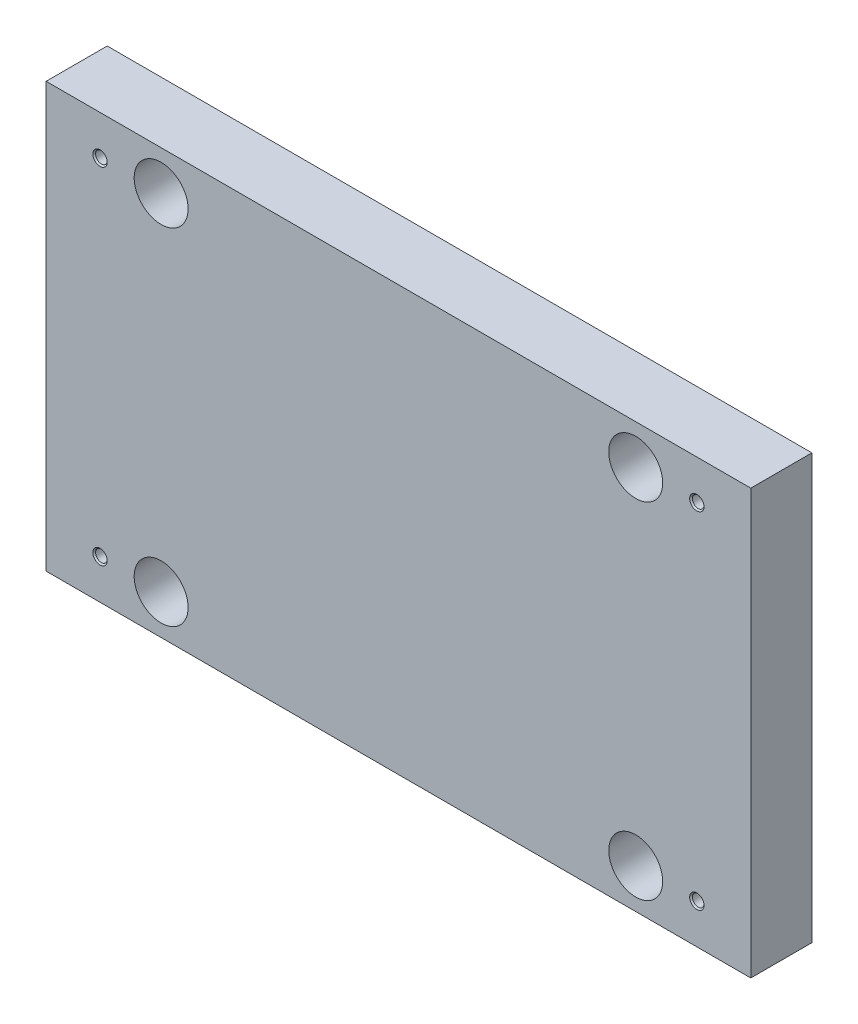
ISO-10303-21;
HEADER;
FILE_DESCRIPTION(('STEP AP214'),'2;1');
FILE_NAME('part.step','',(''),(''),'','','');
FILE_SCHEMA(('AUTOMOTIVE_DESIGN { 1 0 10303 214 1 1 1 1 }'));
ENDSEC;
DATA;
#1=APPLICATION_CONTEXT('core data for automotive mechanical design processes');
#2=APPLICATION_PROTOCOL_DEFINITION('international standard','automotive_design',2000,#1);
#3=PRODUCT_CONTEXT('',#1,'mechanical');
#4=PRODUCT('Part','Part','',(#3));
#5=PRODUCT_RELATED_PRODUCT_CATEGORY('part','',(#4));
#6=PRODUCT_DEFINITION_FORMATION('','',#4);
#7=PRODUCT_DEFINITION_CONTEXT('part definition',#1,'design');
#8=PRODUCT_DEFINITION('design','',#6,#7);
#9=PRODUCT_DEFINITION_SHAPE('','',#8);
#10=(LENGTH_UNIT() NAMED_UNIT(*) SI_UNIT(.MILLI.,.METRE.));
#11=(NAMED_UNIT(*) PLANE_ANGLE_UNIT() SI_UNIT($,.RADIAN.));
#12=(NAMED_UNIT(*) SI_UNIT($,.STERADIAN.) SOLID_ANGLE_UNIT());
#13=UNCERTAINTY_MEASURE_WITH_UNIT(LENGTH_MEASURE(1.E-05),#10,'distance_accuracy_value','');
#14=(GEOMETRIC_REPRESENTATION_CONTEXT(3) GLOBAL_UNCERTAINTY_ASSIGNED_CONTEXT((#13)) GLOBAL_UNIT_ASSIGNED_CONTEXT((#10,
#11,#12)) REPRESENTATION_CONTEXT('',''));
#15=CARTESIAN_POINT('',(0.,0.,0.));
#16=DIRECTION('',(0.,0.,1.));
#17=DIRECTION('',(1.,0.,0.));
#18=AXIS2_PLACEMENT_3D('',#15,#16,#17);
#19=CARTESIAN_POINT('',(98.,-59.,0.));
#20=DIRECTION('',(1.,0.,0.));
#21=DIRECTION('',(0.,0.,-1.));
#22=AXIS2_PLACEMENT_3D('',#19,#20,#21);
#23=PLANE('',#22);
#24=DIRECTION('',(0.,1.,0.));
#25=VECTOR('',#24,1.);
#26=CARTESIAN_POINT('',(98.,-59.,17.));
#27=LINE('',#26,#25);
#28=CARTESIAN_POINT('',(98.,-59.,17.));
#29=VERTEX_POINT('',#28);
#30=CARTESIAN_POINT('',(98.,59.,17.));
#31=VERTEX_POINT('',#30);
#32=EDGE_CURVE('E127',#29,#31,#27,.T.);
#33=ORIENTED_EDGE('',*,*,#32,.F.);
#34=DIRECTION('',(0.,0.,1.));
#35=VECTOR('',#34,1.);
#36=CARTESIAN_POINT('',(98.,-59.,0.));
#37=LINE('',#36,#35);
#38=CARTESIAN_POINT('',(98.,-59.,0.));
#39=VERTEX_POINT('',#38);
#40=EDGE_CURVE('E57',#39,#29,#37,.T.);
#41=ORIENTED_EDGE('',*,*,#40,.F.);
#42=DIRECTION('',(0.,1.,0.));
#43=VECTOR('',#42,1.);
#44=CARTESIAN_POINT('',(98.,-59.,0.));
#45=LINE('',#44,#43);
#46=CARTESIAN_POINT('',(98.,59.,0.));
#47=VERTEX_POINT('',#46);
#48=EDGE_CURVE('E128',#39,#47,#45,.T.);
#49=ORIENTED_EDGE('',*,*,#48,.T.);
#50=DIRECTION('',(0.,0.,1.));
#51=VECTOR('',#50,1.);
#52=CARTESIAN_POINT('',(98.,59.,0.));
#53=LINE('',#52,#51);
#54=EDGE_CURVE('E86',#47,#31,#53,.T.);
#55=ORIENTED_EDGE('',*,*,#54,.T.);
#56=EDGE_LOOP('',(#33,#41,#49,#55));
#57=FACE_BOUND('',#56,.T.);
#58=ADVANCED_FACE('F39',(#57),#23,.T.);
#59=CARTESIAN_POINT('',(-98.,-59.,0.));
#60=DIRECTION('',(0.,-1.,0.));
#61=DIRECTION('',(0.,0.,-1.));
#62=AXIS2_PLACEMENT_3D('',#59,#60,#61);
#63=PLANE('',#62);
#64=DIRECTION('',(1.,0.,0.));
#65=VECTOR('',#64,1.);
#66=CARTESIAN_POINT('',(-98.,-59.,17.));
#67=LINE('',#66,#65);
#68=CARTESIAN_POINT('',(-98.,-59.,17.));
#69=VERTEX_POINT('',#68);
#70=EDGE_CURVE('E131',#69,#29,#67,.T.);
#71=ORIENTED_EDGE('',*,*,#70,.F.);
#72=DIRECTION('',(0.,0.,1.));
#73=VECTOR('',#72,1.);
#74=CARTESIAN_POINT('',(-98.,-59.,0.));
#75=LINE('',#74,#73);
#76=CARTESIAN_POINT('',(-98.,-59.,0.));
#77=VERTEX_POINT('',#76);
#78=EDGE_CURVE('E75',#77,#69,#75,.T.);
#79=ORIENTED_EDGE('',*,*,#78,.F.);
#80=DIRECTION('',(1.,0.,0.));
#81=VECTOR('',#80,1.);
#82=CARTESIAN_POINT('',(-98.,-59.,0.));
#83=LINE('',#82,#81);
#84=EDGE_CURVE('E135',#77,#39,#83,.T.);
#85=ORIENTED_EDGE('',*,*,#84,.T.);
#86=ORIENTED_EDGE('',*,*,#40,.T.);
#87=EDGE_LOOP('',(#71,#79,#85,#86));
#88=FACE_BOUND('',#87,.T.);
#89=ADVANCED_FACE('F187',(#88),#63,.T.);
#90=CARTESIAN_POINT('',(-98.,59.,0.));
#91=DIRECTION('',(-1.,0.,0.));
#92=DIRECTION('',(0.,0.,1.));
#93=AXIS2_PLACEMENT_3D('',#90,#91,#92);
#94=PLANE('',#93);
#95=DIRECTION('',(0.,-1.,0.));
#96=VECTOR('',#95,1.);
#97=CARTESIAN_POINT('',(-98.,59.,17.));
#98=LINE('',#97,#96);
#99=CARTESIAN_POINT('',(-98.,59.,17.));
#100=VERTEX_POINT('',#99);
#101=EDGE_CURVE('E142',#100,#69,#98,.T.);
#102=ORIENTED_EDGE('',*,*,#101,.F.);
#103=DIRECTION('',(0.,0.,1.));
#104=VECTOR('',#103,1.);
#105=CARTESIAN_POINT('',(-98.,59.,0.));
#106=LINE('',#105,#104);
#107=CARTESIAN_POINT('',(-98.,59.,0.));
#108=VERTEX_POINT('',#107);
#109=EDGE_CURVE('E149',#108,#100,#106,.T.);
#110=ORIENTED_EDGE('',*,*,#109,.F.);
#111=DIRECTION('',(0.,-1.,0.));
#112=VECTOR('',#111,1.);
#113=CARTESIAN_POINT('',(-98.,59.,0.));
#114=LINE('',#113,#112);
#115=EDGE_CURVE('E133',#108,#77,#114,.T.);
#116=ORIENTED_EDGE('',*,*,#115,.T.);
#117=ORIENTED_EDGE('',*,*,#78,.T.);
#118=EDGE_LOOP('',(#102,#110,#116,#117));
#119=FACE_BOUND('',#118,.T.);
#120=ADVANCED_FACE('F192',(#119),#94,.T.);
#121=CARTESIAN_POINT('',(98.,59.,0.));
#122=DIRECTION('',(0.,1.,0.));
#123=DIRECTION('',(0.,0.,1.));
#124=AXIS2_PLACEMENT_3D('',#121,#122,#123);
#125=PLANE('',#124);
#126=DIRECTION('',(-1.,0.,0.));
#127=VECTOR('',#126,1.);
#128=CARTESIAN_POINT('',(98.,59.,17.));
#129=LINE('',#128,#127);
#130=EDGE_CURVE('E139',#31,#100,#129,.T.);
#131=ORIENTED_EDGE('',*,*,#130,.F.);
#132=ORIENTED_EDGE('',*,*,#54,.F.);
#133=DIRECTION('',(-1.,0.,0.));
#134=VECTOR('',#133,1.);
#135=CARTESIAN_POINT('',(98.,59.,0.));
#136=LINE('',#135,#134);
#137=EDGE_CURVE('E130',#47,#108,#136,.T.);
#138=ORIENTED_EDGE('',*,*,#137,.T.);
#139=ORIENTED_EDGE('',*,*,#109,.T.);
#140=EDGE_LOOP('',(#131,#132,#138,#139));
#141=FACE_BOUND('',#140,.T.);
#142=ADVANCED_FACE('F196',(#141),#125,.T.);
#143=CARTESIAN_POINT('',(0.,0.,0.));
#144=DIRECTION('',(0.,0.,1.));
#145=DIRECTION('',(1.,0.,0.));
#146=AXIS2_PLACEMENT_3D('',#143,#144,#145);
#147=PLANE('',#146);
#148=CARTESIAN_POINT('',(66.,48.,0.));
#149=DIRECTION('',(0.,0.,1.));
#150=DIRECTION('',(1.,0.,0.));
#151=AXIS2_PLACEMENT_3D('',#148,#149,#150);
#152=CIRCLE('',#151,4.5);
#153=CARTESIAN_POINT('',(70.5,48.,0.));
#154=VERTEX_POINT('',#153);
#155=EDGE_CURVE('E502',#154,#154,#152,.T.);
#156=ORIENTED_EDGE('',*,*,#155,.T.);
#157=EDGE_LOOP('',(#156));
#158=FACE_BOUND('',#157,.T.);
#159=CARTESIAN_POINT('',(66.,-48.,0.));
#160=DIRECTION('',(0.,0.,1.));
#161=DIRECTION('',(1.,0.,0.));
#162=AXIS2_PLACEMENT_3D('',#159,#160,#161);
#163=CIRCLE('',#162,4.5);
#164=CARTESIAN_POINT('',(70.5,-48.,0.));
#165=VERTEX_POINT('',#164);
#166=EDGE_CURVE('E490',#165,#165,#163,.T.);
#167=ORIENTED_EDGE('',*,*,#166,.T.);
#168=EDGE_LOOP('',(#167));
#169=FACE_BOUND('',#168,.T.);
#170=CARTESIAN_POINT('',(-66.,48.,0.));
#171=DIRECTION('',(0.,0.,1.));
#172=DIRECTION('',(1.,0.,0.));
#173=AXIS2_PLACEMENT_3D('',#170,#171,#172);
#174=CIRCLE('',#173,4.50000000000001);
#175=CARTESIAN_POINT('',(-61.5,48.,0.));
#176=VERTEX_POINT('',#175);
#177=EDGE_CURVE('E478',#176,#176,#174,.T.);
#178=ORIENTED_EDGE('',*,*,#177,.T.);
#179=EDGE_LOOP('',(#178));
#180=FACE_BOUND('',#179,.T.);
#181=CARTESIAN_POINT('',(-66.,-48.,0.));
#182=DIRECTION('',(0.,0.,1.));
#183=DIRECTION('',(1.,0.,0.));
#184=AXIS2_PLACEMENT_3D('',#181,#182,#183);
#185=CIRCLE('',#184,4.50000000000001);
#186=CARTESIAN_POINT('',(-61.5,-48.,0.));
#187=VERTEX_POINT('',#186);
#188=EDGE_CURVE('E112',#187,#187,#185,.T.);
#189=ORIENTED_EDGE('',*,*,#188,.T.);
#190=EDGE_LOOP('',(#189));
#191=FACE_BOUND('',#190,.T.);
#192=ORIENTED_EDGE('',*,*,#48,.F.);
#193=ORIENTED_EDGE('',*,*,#84,.F.);
#194=ORIENTED_EDGE('',*,*,#115,.F.);
#195=ORIENTED_EDGE('',*,*,#137,.F.);
#196=EDGE_LOOP('',(#192,#193,#194,#195));
#197=FACE_BOUND('',#196,.T.);
#198=ADVANCED_FACE('F236',(#158,#169,#180,#191,#197),#147,.F.);
#199=CARTESIAN_POINT('',(0.,0.,17.));
#200=DIRECTION('',(0.,0.,1.));
#201=DIRECTION('',(1.,0.,0.));
#202=AXIS2_PLACEMENT_3D('',#199,#200,#201);
#203=PLANE('',#202);
#204=CARTESIAN_POINT('',(83.,-48.,17.));
#205=DIRECTION('',(0.,0.,1.));
#206=DIRECTION('',(1.,0.,0.));
#207=AXIS2_PLACEMENT_3D('',#204,#205,#206);
#208=CIRCLE('',#207,2.);
#209=CARTESIAN_POINT('',(85.,-48.,17.));
#210=VERTEX_POINT('',#209);
#211=EDGE_CURVE('E163',#210,#210,#208,.F.);
#212=ORIENTED_EDGE('',*,*,#211,.T.);
#213=EDGE_LOOP('',(#212));
#214=FACE_BOUND('',#213,.T.);
#215=CARTESIAN_POINT('',(83.,48.,17.));
#216=DIRECTION('',(0.,0.,1.));
#217=DIRECTION('',(1.,0.,0.));
#218=AXIS2_PLACEMENT_3D('',#215,#216,#217);
#219=CIRCLE('',#218,2.);
#220=CARTESIAN_POINT('',(85.,48.,17.));
#221=VERTEX_POINT('',#220);
#222=EDGE_CURVE('E160',#221,#221,#219,.F.);
#223=ORIENTED_EDGE('',*,*,#222,.T.);
#224=EDGE_LOOP('',(#223));
#225=FACE_BOUND('',#224,.T.);
#226=CARTESIAN_POINT('',(-83.,48.,17.));
#227=DIRECTION('',(0.,0.,1.));
#228=DIRECTION('',(1.,0.,0.));
#229=AXIS2_PLACEMENT_3D('',#226,#227,#228);
#230=CIRCLE('',#229,2.);
#231=CARTESIAN_POINT('',(-81.,48.,17.));
#232=VERTEX_POINT('',#231);
#233=EDGE_CURVE('E157',#232,#232,#230,.F.);
#234=ORIENTED_EDGE('',*,*,#233,.T.);
#235=EDGE_LOOP('',(#234));
#236=FACE_BOUND('',#235,.T.);
#237=CARTESIAN_POINT('',(-83.,-48.,17.));
#238=DIRECTION('',(0.,0.,1.));
#239=DIRECTION('',(1.,0.,0.));
#240=AXIS2_PLACEMENT_3D('',#237,#238,#239);
#241=CIRCLE('',#240,2.);
#242=CARTESIAN_POINT('',(-81.,-48.,17.));
#243=VERTEX_POINT('',#242);
#244=EDGE_CURVE('E154',#243,#243,#241,.F.);
#245=ORIENTED_EDGE('',*,*,#244,.T.);
#246=EDGE_LOOP('',(#245));
#247=FACE_BOUND('',#246,.T.);
#248=CARTESIAN_POINT('',(66.,48.,17.));
#249=DIRECTION('',(0.,0.,1.));
#250=DIRECTION('',(1.,0.,0.));
#251=AXIS2_PLACEMENT_3D('',#248,#249,#250);
#252=CIRCLE('',#251,7.49999999999999);
#253=CARTESIAN_POINT('',(73.5,48.,17.));
#254=VERTEX_POINT('',#253);
#255=EDGE_CURVE('E511',#254,#254,#252,.T.);
#256=ORIENTED_EDGE('',*,*,#255,.F.);
#257=EDGE_LOOP('',(#256));
#258=FACE_BOUND('',#257,.T.);
#259=CARTESIAN_POINT('',(66.,-48.,17.));
#260=DIRECTION('',(0.,0.,1.));
#261=DIRECTION('',(1.,0.,0.));
#262=AXIS2_PLACEMENT_3D('',#259,#260,#261);
#263=CIRCLE('',#262,7.49999999999999);
#264=CARTESIAN_POINT('',(73.5,-48.,17.));
#265=VERTEX_POINT('',#264);
#266=EDGE_CURVE('E499',#265,#265,#263,.T.);
#267=ORIENTED_EDGE('',*,*,#266,.F.);
#268=EDGE_LOOP('',(#267));
#269=FACE_BOUND('',#268,.T.);
#270=CARTESIAN_POINT('',(-66.,48.,17.));
#271=DIRECTION('',(0.,0.,1.));
#272=DIRECTION('',(1.,0.,0.));
#273=AXIS2_PLACEMENT_3D('',#270,#271,#272);
#274=CIRCLE('',#273,7.49999999999999);
#275=CARTESIAN_POINT('',(-58.5,48.,17.));
#276=VERTEX_POINT('',#275);
#277=EDGE_CURVE('E487',#276,#276,#274,.T.);
#278=ORIENTED_EDGE('',*,*,#277,.F.);
#279=EDGE_LOOP('',(#278));
#280=FACE_BOUND('',#279,.T.);
#281=CARTESIAN_POINT('',(-66.,-48.,17.));
#282=DIRECTION('',(0.,0.,1.));
#283=DIRECTION('',(1.,0.,0.));
#284=AXIS2_PLACEMENT_3D('',#281,#282,#283);
#285=CIRCLE('',#284,7.49999999999999);
#286=CARTESIAN_POINT('',(-58.5,-48.,17.));
#287=VERTEX_POINT('',#286);
#288=EDGE_CURVE('E473',#287,#287,#285,.T.);
#289=ORIENTED_EDGE('',*,*,#288,.F.);
#290=EDGE_LOOP('',(#289));
#291=FACE_BOUND('',#290,.T.);
#292=ORIENTED_EDGE('',*,*,#32,.T.);
#293=ORIENTED_EDGE('',*,*,#130,.T.);
#294=ORIENTED_EDGE('',*,*,#101,.T.);
#295=ORIENTED_EDGE('',*,*,#70,.T.);
#296=EDGE_LOOP('',(#292,#293,#294,#295));
#297=FACE_BOUND('',#296,.T.);
#298=ADVANCED_FACE('F230',(#214,#225,#236,#247,#258,#269,#280,#291,#297),#203,.T.);
#299=CARTESIAN_POINT('',(83.,-48.,5.78118424797711));
#300=DIRECTION('',(0.,0.,1.));
#301=DIRECTION('',(1.,0.,0.));
#302=AXIS2_PLACEMENT_3D('',#299,#300,#301);
#303=CONICAL_SURFACE('',#302,1.62099999999998,1.04719755119658);
#304=CARTESIAN_POINT('',(83.,-48.,4.8452994616207));
#305=VERTEX_POINT('',#304);
#306=VERTEX_LOOP('',#305);
#307=FACE_BOUND('',#306,.T.);
#308=CARTESIAN_POINT('',(83.,-48.,5.78118424797711));
#309=DIRECTION('',(0.,0.,1.));
#310=DIRECTION('',(1.,0.,0.));
#311=AXIS2_PLACEMENT_3D('',#308,#309,#310);
#312=CIRCLE('',#311,1.62099999999998);
#313=CARTESIAN_POINT('',(84.621,-48.,5.78118424797711));
#314=VERTEX_POINT('',#313);
#315=EDGE_CURVE('E124',#314,#314,#312,.T.);
#316=ORIENTED_EDGE('',*,*,#315,.T.);
#317=EDGE_LOOP('',(#316));
#318=FACE_BOUND('',#317,.T.);
#319=ADVANCED_FACE('F225',(#307,#318),#303,.F.);
#320=CARTESIAN_POINT('',(83.,-48.,17.));
#321=DIRECTION('',(0.,0.,1.));
#322=DIRECTION('',(1.,0.,0.));
#323=AXIS2_PLACEMENT_3D('',#320,#321,#322);
#324=CYLINDRICAL_SURFACE('',#323,1.62099999999998);
#325=CARTESIAN_POINT('',(83.,-48.,16.621));
#326=DIRECTION('',(0.,0.,1.));
#327=DIRECTION('',(1.,0.,0.));
#328=AXIS2_PLACEMENT_3D('',#325,#326,#327);
#329=CIRCLE('',#328,1.62099999999998);
#330=CARTESIAN_POINT('',(84.621,-48.,16.621));
#331=VERTEX_POINT('',#330);
#332=EDGE_CURVE('E147',#331,#331,#329,.T.);
#333=ORIENTED_EDGE('',*,*,#332,.T.);
#334=EDGE_LOOP('',(#333));
#335=FACE_BOUND('',#334,.T.);
#336=ORIENTED_EDGE('',*,*,#315,.F.);
#337=EDGE_LOOP('',(#336));
#338=FACE_BOUND('',#337,.T.);
#339=ADVANCED_FACE('F221',(#335,#338),#324,.F.);
#340=CARTESIAN_POINT('',(83.,48.,5.78118424797711));
#341=DIRECTION('',(0.,0.,1.));
#342=DIRECTION('',(1.,0.,0.));
#343=AXIS2_PLACEMENT_3D('',#340,#341,#342);
#344=CONICAL_SURFACE('',#343,1.62099999999998,1.04719755119658);
#345=CARTESIAN_POINT('',(83.,48.,4.8452994616207));
#346=VERTEX_POINT('',#345);
#347=VERTEX_LOOP('',#346);
#348=FACE_BOUND('',#347,.T.);
#349=CARTESIAN_POINT('',(83.,48.,5.78118424797711));
#350=DIRECTION('',(0.,0.,1.));
#351=DIRECTION('',(1.,0.,0.));
#352=AXIS2_PLACEMENT_3D('',#349,#350,#351);
#353=CIRCLE('',#352,1.62099999999998);
#354=CARTESIAN_POINT('',(84.621,48.,5.78118424797711));
#355=VERTEX_POINT('',#354);
#356=EDGE_CURVE('E115',#355,#355,#353,.T.);
#357=ORIENTED_EDGE('',*,*,#356,.T.);
#358=EDGE_LOOP('',(#357));
#359=FACE_BOUND('',#358,.T.);
#360=ADVANCED_FACE('F224',(#348,#359),#344,.F.);
#361=CARTESIAN_POINT('',(83.,48.,17.));
#362=DIRECTION('',(0.,0.,1.));
#363=DIRECTION('',(1.,0.,0.));
#364=AXIS2_PLACEMENT_3D('',#361,#362,#363);
#365=CYLINDRICAL_SURFACE('',#364,1.62099999999998);
#366=CARTESIAN_POINT('',(83.,48.,16.621));
#367=DIRECTION('',(0.,0.,1.));
#368=DIRECTION('',(1.,0.,0.));
#369=AXIS2_PLACEMENT_3D('',#366,#367,#368);
#370=CIRCLE('',#369,1.62099999999998);
#371=CARTESIAN_POINT('',(84.621,48.,16.621));
#372=VERTEX_POINT('',#371);
#373=EDGE_CURVE('E166',#372,#372,#370,.T.);
#374=ORIENTED_EDGE('',*,*,#373,.T.);
#375=EDGE_LOOP('',(#374));
#376=FACE_BOUND('',#375,.T.);
#377=ORIENTED_EDGE('',*,*,#356,.F.);
#378=EDGE_LOOP('',(#377));
#379=FACE_BOUND('',#378,.T.);
#380=ADVANCED_FACE('F281',(#376,#379),#365,.F.);
#381=CARTESIAN_POINT('',(-83.,-48.,5.78118424797711));
#382=DIRECTION('',(0.,0.,1.));
#383=DIRECTION('',(1.,0.,0.));
#384=AXIS2_PLACEMENT_3D('',#381,#382,#383);
#385=CONICAL_SURFACE('',#384,1.62099999999998,1.04719755119658);
#386=CARTESIAN_POINT('',(-83.,-48.,4.8452994616207));
#387=VERTEX_POINT('',#386);
#388=VERTEX_LOOP('',#387);
#389=FACE_BOUND('',#388,.T.);
#390=CARTESIAN_POINT('',(-83.,-48.,5.78118424797711));
#391=DIRECTION('',(0.,0.,1.));
#392=DIRECTION('',(1.,0.,0.));
#393=AXIS2_PLACEMENT_3D('',#390,#391,#392);
#394=CIRCLE('',#393,1.62099999999998);
#395=CARTESIAN_POINT('',(-81.379,-48.,5.78118424797711));
#396=VERTEX_POINT('',#395);
#397=EDGE_CURVE('E111',#396,#396,#394,.T.);
#398=ORIENTED_EDGE('',*,*,#397,.T.);
#399=EDGE_LOOP('',(#398));
#400=FACE_BOUND('',#399,.T.);
#401=ADVANCED_FACE('F286',(#389,#400),#385,.F.);
#402=CARTESIAN_POINT('',(-83.,-48.,17.));
#403=DIRECTION('',(0.,0.,1.));
#404=DIRECTION('',(1.,0.,0.));
#405=AXIS2_PLACEMENT_3D('',#402,#403,#404);
#406=CYLINDRICAL_SURFACE('',#405,1.62099999999998);
#407=CARTESIAN_POINT('',(-83.,-48.,16.621));
#408=DIRECTION('',(0.,0.,1.));
#409=DIRECTION('',(1.,0.,0.));
#410=AXIS2_PLACEMENT_3D('',#407,#408,#409);
#411=CIRCLE('',#410,1.62099999999998);
#412=CARTESIAN_POINT('',(-81.379,-48.,16.621));
#413=VERTEX_POINT('',#412);
#414=EDGE_CURVE('E11',#413,#413,#411,.T.);
#415=ORIENTED_EDGE('',*,*,#414,.T.);
#416=EDGE_LOOP('',(#415));
#417=FACE_BOUND('',#416,.T.);
#418=ORIENTED_EDGE('',*,*,#397,.F.);
#419=EDGE_LOOP('',(#418));
#420=FACE_BOUND('',#419,.T.);
#421=ADVANCED_FACE('F105',(#417,#420),#406,.F.);
#422=CARTESIAN_POINT('',(-83.,48.,5.78118424797711));
#423=DIRECTION('',(0.,0.,1.));
#424=DIRECTION('',(1.,0.,0.));
#425=AXIS2_PLACEMENT_3D('',#422,#423,#424);
#426=CONICAL_SURFACE('',#425,1.62099999999998,1.04719755119658);
#427=CARTESIAN_POINT('',(-83.,48.,4.8452994616207));
#428=VERTEX_POINT('',#427);
#429=VERTEX_LOOP('',#428);
#430=FACE_BOUND('',#429,.T.);
#431=CARTESIAN_POINT('',(-83.,48.,5.78118424797711));
#432=DIRECTION('',(0.,0.,1.));
#433=DIRECTION('',(1.,0.,0.));
#434=AXIS2_PLACEMENT_3D('',#431,#432,#433);
#435=CIRCLE('',#434,1.62099999999998);
#436=CARTESIAN_POINT('',(-81.379,48.,5.78118424797711));
#437=VERTEX_POINT('',#436);
#438=EDGE_CURVE('E109',#437,#437,#435,.T.);
#439=ORIENTED_EDGE('',*,*,#438,.T.);
#440=EDGE_LOOP('',(#439));
#441=FACE_BOUND('',#440,.T.);
#442=ADVANCED_FACE('F101',(#430,#441),#426,.F.);
#443=CARTESIAN_POINT('',(-83.,48.,17.));
#444=DIRECTION('',(0.,0.,1.));
#445=DIRECTION('',(1.,0.,0.));
#446=AXIS2_PLACEMENT_3D('',#443,#444,#445);
#447=CYLINDRICAL_SURFACE('',#446,1.62099999999998);
#448=CARTESIAN_POINT('',(-83.,48.,16.621));
#449=DIRECTION('',(0.,0.,1.));
#450=DIRECTION('',(1.,0.,0.));
#451=AXIS2_PLACEMENT_3D('',#448,#449,#450);
#452=CIRCLE('',#451,1.62099999999998);
#453=CARTESIAN_POINT('',(-81.379,48.,16.621));
#454=VERTEX_POINT('',#453);
#455=EDGE_CURVE('E49',#454,#454,#452,.T.);
#456=ORIENTED_EDGE('',*,*,#455,.T.);
#457=EDGE_LOOP('',(#456));
#458=FACE_BOUND('',#457,.T.);
#459=ORIENTED_EDGE('',*,*,#438,.F.);
#460=EDGE_LOOP('',(#459));
#461=FACE_BOUND('',#460,.T.);
#462=ADVANCED_FACE('F104',(#458,#461),#447,.F.);
#463=CARTESIAN_POINT('',(-66.,-48.,17.));
#464=DIRECTION('',(0.,0.,1.));
#465=DIRECTION('',(1.,0.,0.));
#466=AXIS2_PLACEMENT_3D('',#463,#464,#465);
#467=CYLINDRICAL_SURFACE('',#466,4.50000000000001);
#468=ORIENTED_EDGE('',*,*,#188,.F.);
#469=EDGE_LOOP('',(#468));
#470=FACE_BOUND('',#469,.T.);
#471=CARTESIAN_POINT('',(-66.,-48.,6.));
#472=DIRECTION('',(0.,0.,1.));
#473=DIRECTION('',(1.,0.,0.));
#474=AXIS2_PLACEMENT_3D('',#471,#472,#473);
#475=CIRCLE('',#474,4.50000000000001);
#476=CARTESIAN_POINT('',(-61.5,-48.,6.));
#477=VERTEX_POINT('',#476);
#478=EDGE_CURVE('E118',#477,#477,#475,.T.);
#479=ORIENTED_EDGE('',*,*,#478,.T.);
#480=EDGE_LOOP('',(#479));
#481=FACE_BOUND('',#480,.T.);
#482=ADVANCED_FACE('F307',(#470,#481),#467,.F.);
#483=CARTESIAN_POINT('',(-61.5,-48.,6.));
#484=DIRECTION('',(0.,0.,-1.));
#485=DIRECTION('',(-1.,0.,0.));
#486=AXIS2_PLACEMENT_3D('',#483,#484,#485);
#487=PLANE('',#486);
#488=ORIENTED_EDGE('',*,*,#478,.F.);
#489=EDGE_LOOP('',(#488));
#490=FACE_BOUND('',#489,.T.);
#491=CARTESIAN_POINT('',(-66.,-48.,6.));
#492=DIRECTION('',(0.,0.,1.));
#493=DIRECTION('',(1.,0.,0.));
#494=AXIS2_PLACEMENT_3D('',#491,#492,#493);
#495=CIRCLE('',#494,7.49999999999999);
#496=CARTESIAN_POINT('',(-58.5,-48.,6.));
#497=VERTEX_POINT('',#496);
#498=EDGE_CURVE('E471',#497,#497,#495,.T.);
#499=ORIENTED_EDGE('',*,*,#498,.T.);
#500=EDGE_LOOP('',(#499));
#501=FACE_BOUND('',#500,.T.);
#502=ADVANCED_FACE('F413',(#490,#501),#487,.F.);
#503=CARTESIAN_POINT('',(-66.,-48.,17.));
#504=DIRECTION('',(0.,0.,1.));
#505=DIRECTION('',(1.,0.,0.));
#506=AXIS2_PLACEMENT_3D('',#503,#504,#505);
#507=CYLINDRICAL_SURFACE('',#506,7.49999999999999);
#508=ORIENTED_EDGE('',*,*,#498,.F.);
#509=EDGE_LOOP('',(#508));
#510=FACE_BOUND('',#509,.T.);
#511=ORIENTED_EDGE('',*,*,#288,.T.);
#512=EDGE_LOOP('',(#511));
#513=FACE_BOUND('',#512,.T.);
#514=ADVANCED_FACE('F404',(#510,#513),#507,.F.);
#515=CARTESIAN_POINT('',(-66.,48.,17.));
#516=DIRECTION('',(0.,0.,1.));
#517=DIRECTION('',(1.,0.,0.));
#518=AXIS2_PLACEMENT_3D('',#515,#516,#517);
#519=CYLINDRICAL_SURFACE('',#518,4.50000000000001);
#520=ORIENTED_EDGE('',*,*,#177,.F.);
#521=EDGE_LOOP('',(#520));
#522=FACE_BOUND('',#521,.T.);
#523=CARTESIAN_POINT('',(-66.,48.,6.));
#524=DIRECTION('',(0.,0.,1.));
#525=DIRECTION('',(1.,0.,0.));
#526=AXIS2_PLACEMENT_3D('',#523,#524,#525);
#527=CIRCLE('',#526,4.50000000000001);
#528=CARTESIAN_POINT('',(-61.5,48.,6.));
#529=VERTEX_POINT('',#528);
#530=EDGE_CURVE('E481',#529,#529,#527,.T.);
#531=ORIENTED_EDGE('',*,*,#530,.T.);
#532=EDGE_LOOP('',(#531));
#533=FACE_BOUND('',#532,.T.);
#534=ADVANCED_FACE('F395',(#522,#533),#519,.F.);
#535=CARTESIAN_POINT('',(-61.5,48.,6.));
#536=DIRECTION('',(0.,0.,-1.));
#537=DIRECTION('',(-1.,0.,0.));
#538=AXIS2_PLACEMENT_3D('',#535,#536,#537);
#539=PLANE('',#538);
#540=ORIENTED_EDGE('',*,*,#530,.F.);
#541=EDGE_LOOP('',(#540));
#542=FACE_BOUND('',#541,.T.);
#543=CARTESIAN_POINT('',(-66.,48.,6.));
#544=DIRECTION('',(0.,0.,1.));
#545=DIRECTION('',(1.,0.,0.));
#546=AXIS2_PLACEMENT_3D('',#543,#544,#545);
#547=CIRCLE('',#546,7.49999999999999);
#548=CARTESIAN_POINT('',(-58.5,48.,6.));
#549=VERTEX_POINT('',#548);
#550=EDGE_CURVE('E484',#549,#549,#547,.T.);
#551=ORIENTED_EDGE('',*,*,#550,.T.);
#552=EDGE_LOOP('',(#551));
#553=FACE_BOUND('',#552,.T.);
#554=ADVANCED_FACE('F386',(#542,#553),#539,.F.);
#555=CARTESIAN_POINT('',(-66.,48.,17.));
#556=DIRECTION('',(0.,0.,1.));
#557=DIRECTION('',(1.,0.,0.));
#558=AXIS2_PLACEMENT_3D('',#555,#556,#557);
#559=CYLINDRICAL_SURFACE('',#558,7.49999999999999);
#560=ORIENTED_EDGE('',*,*,#550,.F.);
#561=EDGE_LOOP('',(#560));
#562=FACE_BOUND('',#561,.T.);
#563=ORIENTED_EDGE('',*,*,#277,.T.);
#564=EDGE_LOOP('',(#563));
#565=FACE_BOUND('',#564,.T.);
#566=ADVANCED_FACE('F377',(#562,#565),#559,.F.);
#567=CARTESIAN_POINT('',(66.,-48.,17.));
#568=DIRECTION('',(0.,0.,1.));
#569=DIRECTION('',(1.,0.,0.));
#570=AXIS2_PLACEMENT_3D('',#567,#568,#569);
#571=CYLINDRICAL_SURFACE('',#570,4.50000000000001);
#572=ORIENTED_EDGE('',*,*,#166,.F.);
#573=EDGE_LOOP('',(#572));
#574=FACE_BOUND('',#573,.T.);
#575=CARTESIAN_POINT('',(66.,-48.,6.));
#576=DIRECTION('',(0.,0.,1.));
#577=DIRECTION('',(1.,0.,0.));
#578=AXIS2_PLACEMENT_3D('',#575,#576,#577);
#579=CIRCLE('',#578,4.50000000000002);
#580=CARTESIAN_POINT('',(70.5,-48.,6.));
#581=VERTEX_POINT('',#580);
#582=EDGE_CURVE('E493',#581,#581,#579,.T.);
#583=ORIENTED_EDGE('',*,*,#582,.T.);
#584=EDGE_LOOP('',(#583));
#585=FACE_BOUND('',#584,.T.);
#586=ADVANCED_FACE('F368',(#574,#585),#571,.F.);
#587=CARTESIAN_POINT('',(70.5,-48.,6.));
#588=DIRECTION('',(0.,0.,-1.));
#589=DIRECTION('',(-1.,0.,0.));
#590=AXIS2_PLACEMENT_3D('',#587,#588,#589);
#591=PLANE('',#590);
#592=ORIENTED_EDGE('',*,*,#582,.F.);
#593=EDGE_LOOP('',(#592));
#594=FACE_BOUND('',#593,.T.);
#595=CARTESIAN_POINT('',(66.,-48.,6.));
#596=DIRECTION('',(0.,0.,1.));
#597=DIRECTION('',(1.,0.,0.));
#598=AXIS2_PLACEMENT_3D('',#595,#596,#597);
#599=CIRCLE('',#598,7.49999999999999);
#600=CARTESIAN_POINT('',(73.5,-48.,6.));
#601=VERTEX_POINT('',#600);
#602=EDGE_CURVE('E496',#601,#601,#599,.T.);
#603=ORIENTED_EDGE('',*,*,#602,.T.);
#604=EDGE_LOOP('',(#603));
#605=FACE_BOUND('',#604,.T.);
#606=ADVANCED_FACE('F359',(#594,#605),#591,.F.);
#607=CARTESIAN_POINT('',(66.,-48.,17.));
#608=DIRECTION('',(0.,0.,1.));
#609=DIRECTION('',(1.,0.,0.));
#610=AXIS2_PLACEMENT_3D('',#607,#608,#609);
#611=CYLINDRICAL_SURFACE('',#610,7.49999999999999);
#612=ORIENTED_EDGE('',*,*,#602,.F.);
#613=EDGE_LOOP('',(#612));
#614=FACE_BOUND('',#613,.T.);
#615=ORIENTED_EDGE('',*,*,#266,.T.);
#616=EDGE_LOOP('',(#615));
#617=FACE_BOUND('',#616,.T.);
#618=ADVANCED_FACE('F350',(#614,#617),#611,.F.);
#619=CARTESIAN_POINT('',(66.,48.,17.));
#620=DIRECTION('',(0.,0.,1.));
#621=DIRECTION('',(1.,0.,0.));
#622=AXIS2_PLACEMENT_3D('',#619,#620,#621);
#623=CYLINDRICAL_SURFACE('',#622,4.50000000000001);
#624=ORIENTED_EDGE('',*,*,#155,.F.);
#625=EDGE_LOOP('',(#624));
#626=FACE_BOUND('',#625,.T.);
#627=CARTESIAN_POINT('',(66.,48.,6.));
#628=DIRECTION('',(0.,0.,1.));
#629=DIRECTION('',(1.,0.,0.));
#630=AXIS2_PLACEMENT_3D('',#627,#628,#629);
#631=CIRCLE('',#630,4.50000000000002);
#632=CARTESIAN_POINT('',(70.5,48.,6.));
#633=VERTEX_POINT('',#632);
#634=EDGE_CURVE('E505',#633,#633,#631,.T.);
#635=ORIENTED_EDGE('',*,*,#634,.T.);
#636=EDGE_LOOP('',(#635));
#637=FACE_BOUND('',#636,.T.);
#638=ADVANCED_FACE('F341',(#626,#637),#623,.F.);
#639=CARTESIAN_POINT('',(70.5,48.,6.));
#640=DIRECTION('',(0.,0.,-1.));
#641=DIRECTION('',(-1.,0.,0.));
#642=AXIS2_PLACEMENT_3D('',#639,#640,#641);
#643=PLANE('',#642);
#644=ORIENTED_EDGE('',*,*,#634,.F.);
#645=EDGE_LOOP('',(#644));
#646=FACE_BOUND('',#645,.T.);
#647=CARTESIAN_POINT('',(66.,48.,6.));
#648=DIRECTION('',(0.,0.,1.));
#649=DIRECTION('',(1.,0.,0.));
#650=AXIS2_PLACEMENT_3D('',#647,#648,#649);
#651=CIRCLE('',#650,7.49999999999999);
#652=CARTESIAN_POINT('',(73.5,48.,6.));
#653=VERTEX_POINT('',#652);
#654=EDGE_CURVE('E508',#653,#653,#651,.T.);
#655=ORIENTED_EDGE('',*,*,#654,.T.);
#656=EDGE_LOOP('',(#655));
#657=FACE_BOUND('',#656,.T.);
#658=ADVANCED_FACE('F214',(#646,#657),#643,.F.);
#659=CARTESIAN_POINT('',(66.,48.,17.));
#660=DIRECTION('',(0.,0.,1.));
#661=DIRECTION('',(1.,0.,0.));
#662=AXIS2_PLACEMENT_3D('',#659,#660,#661);
#663=CYLINDRICAL_SURFACE('',#662,7.49999999999999);
#664=ORIENTED_EDGE('',*,*,#654,.F.);
#665=EDGE_LOOP('',(#664));
#666=FACE_BOUND('',#665,.T.);
#667=ORIENTED_EDGE('',*,*,#255,.T.);
#668=EDGE_LOOP('',(#667));
#669=FACE_BOUND('',#668,.T.);
#670=ADVANCED_FACE('F203',(#666,#669),#663,.F.);
#671=CARTESIAN_POINT('',(83.,-48.,16.621));
#672=DIRECTION('',(0.,0.,1.));
#673=DIRECTION('',(1.,0.,0.));
#674=AXIS2_PLACEMENT_3D('',#671,#672,#673);
#675=CONICAL_SURFACE('',#674,1.62099999999998,0.785398163397471);
#676=ORIENTED_EDGE('',*,*,#211,.F.);
#677=EDGE_LOOP('',(#676));
#678=FACE_BOUND('',#677,.T.);
#679=ORIENTED_EDGE('',*,*,#332,.F.);
#680=EDGE_LOOP('',(#679));
#681=FACE_BOUND('',#680,.T.);
#682=ADVANCED_FACE('F181',(#678,#681),#675,.F.);
#683=CARTESIAN_POINT('',(83.,48.,16.621));
#684=DIRECTION('',(0.,0.,1.));
#685=DIRECTION('',(1.,0.,0.));
#686=AXIS2_PLACEMENT_3D('',#683,#684,#685);
#687=CONICAL_SURFACE('',#686,1.62099999999998,0.785398163397471);
#688=ORIENTED_EDGE('',*,*,#222,.F.);
#689=EDGE_LOOP('',(#688));
#690=FACE_BOUND('',#689,.T.);
#691=ORIENTED_EDGE('',*,*,#373,.F.);
#692=EDGE_LOOP('',(#691));
#693=FACE_BOUND('',#692,.T.);
#694=ADVANCED_FACE('F174',(#690,#693),#687,.F.);
#695=CARTESIAN_POINT('',(-83.,48.,16.621));
#696=DIRECTION('',(0.,0.,1.));
#697=DIRECTION('',(1.,0.,0.));
#698=AXIS2_PLACEMENT_3D('',#695,#696,#697);
#699=CONICAL_SURFACE('',#698,1.62099999999998,0.785398163397471);
#700=ORIENTED_EDGE('',*,*,#233,.F.);
#701=EDGE_LOOP('',(#700));
#702=FACE_BOUND('',#701,.T.);
#703=ORIENTED_EDGE('',*,*,#455,.F.);
#704=EDGE_LOOP('',(#703));
#705=FACE_BOUND('',#704,.T.);
#706=ADVANCED_FACE('F172',(#702,#705),#699,.F.);
#707=CARTESIAN_POINT('',(-83.,-48.,16.621));
#708=DIRECTION('',(0.,0.,1.));
#709=DIRECTION('',(1.,0.,0.));
#710=AXIS2_PLACEMENT_3D('',#707,#708,#709);
#711=CONICAL_SURFACE('',#710,1.62099999999998,0.785398163397471);
#712=ORIENTED_EDGE('',*,*,#244,.F.);
#713=EDGE_LOOP('',(#712));
#714=FACE_BOUND('',#713,.T.);
#715=ORIENTED_EDGE('',*,*,#414,.F.);
#716=EDGE_LOOP('',(#715));
#717=FACE_BOUND('',#716,.T.);
#718=ADVANCED_FACE('F42',(#714,#717),#711,.F.);
#719=CLOSED_SHELL('',(#58,#89,#120,#142,#198,#298,#319,#339,#360,#380,#401,#421,#442,#462,#482,
#502,#514,#534,#554,#566,#586,#606,#618,#638,#658,#670,#682,#694,#706,#718));
#720=MANIFOLD_SOLID_BREP('B2',#719);
#721=ADVANCED_BREP_SHAPE_REPRESENTATION('',(#18,#720),#14);
#722=SHAPE_DEFINITION_REPRESENTATION(#9,#721);
ENDSEC;
END-ISO-10303-21;
